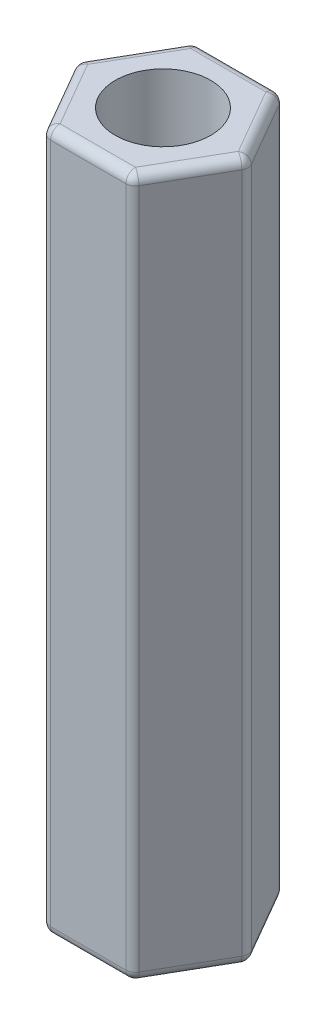
ISO-10303-21;
HEADER;
FILE_DESCRIPTION(('STEP AP214'),'2;1');
FILE_NAME('part.step','',(''),(''),'','','');
FILE_SCHEMA(('AUTOMOTIVE_DESIGN { 1 0 10303 214 1 1 1 1 }'));
ENDSEC;
DATA;
#1=APPLICATION_CONTEXT('core data for automotive mechanical design processes');
#2=APPLICATION_PROTOCOL_DEFINITION('international standard','automotive_design',2000,#1);
#3=PRODUCT_CONTEXT('',#1,'mechanical');
#4=PRODUCT('Part','Part','',(#3));
#5=PRODUCT_RELATED_PRODUCT_CATEGORY('part','',(#4));
#6=PRODUCT_DEFINITION_FORMATION('','',#4);
#7=PRODUCT_DEFINITION_CONTEXT('part definition',#1,'design');
#8=PRODUCT_DEFINITION('design','',#6,#7);
#9=PRODUCT_DEFINITION_SHAPE('','',#8);
#10=(LENGTH_UNIT() NAMED_UNIT(*) SI_UNIT(.MILLI.,.METRE.));
#11=(NAMED_UNIT(*) PLANE_ANGLE_UNIT() SI_UNIT($,.RADIAN.));
#12=(NAMED_UNIT(*) SI_UNIT($,.STERADIAN.) SOLID_ANGLE_UNIT());
#13=UNCERTAINTY_MEASURE_WITH_UNIT(LENGTH_MEASURE(1.E-05),#10,'distance_accuracy_value','');
#14=(GEOMETRIC_REPRESENTATION_CONTEXT(3) GLOBAL_UNCERTAINTY_ASSIGNED_CONTEXT((#13)) GLOBAL_UNIT_ASSIGNED_CONTEXT((#10,
#11,#12)) REPRESENTATION_CONTEXT('',''));
#15=CARTESIAN_POINT('',(0.,0.,0.));
#16=DIRECTION('',(0.,0.,1.));
#17=DIRECTION('',(1.,0.,0.));
#18=AXIS2_PLACEMENT_3D('',#15,#16,#17);
#19=CARTESIAN_POINT('',(0.,22.,0.));
#20=DIRECTION('',(0.,1.,0.));
#21=DIRECTION('',(0.,0.,1.));
#22=AXIS2_PLACEMENT_3D('',#19,#20,#21);
#23=PLANE('',#22);
#24=DIRECTION('',(0.500000000000007,0.,0.866025403784435));
#25=VECTOR('',#24,1.);
#26=CARTESIAN_POINT('',(-1.09696551146027,22.,2.20000000000001));
#27=LINE('',#26,#25);
#28=CARTESIAN_POINT('',(-2.36713610367747,22.,0.));
#29=VERTEX_POINT('',#28);
#30=CARTESIAN_POINT('',(-1.18356805183872,22.,2.05000000000001));
#31=VERTEX_POINT('',#30);
#32=EDGE_CURVE('E255',#29,#31,#27,.T.);
#33=ORIENTED_EDGE('',*,*,#32,.T.);
#34=DIRECTION('',(1.,0.,0.));
#35=VECTOR('',#34,1.);
#36=CARTESIAN_POINT('',(1.35677313259565,22.,2.04999999999999));
#37=LINE('',#36,#35);
#38=CARTESIAN_POINT('',(1.18356805183876,22.,2.04999999999999));
#39=VERTEX_POINT('',#38);
#40=EDGE_CURVE('E257',#31,#39,#37,.T.);
#41=ORIENTED_EDGE('',*,*,#40,.T.);
#42=DIRECTION('',(0.499999999999995,0.,-0.866025403784442));
#43=VECTOR('',#42,1.);
#44=CARTESIAN_POINT('',(2.45373864405591,22.,-0.149999999999998));
#45=LINE('',#44,#43);
#46=CARTESIAN_POINT('',(2.36713610367747,22.,0.));
#47=VERTEX_POINT('',#46);
#48=EDGE_CURVE('E247',#39,#47,#45,.T.);
#49=ORIENTED_EDGE('',*,*,#48,.T.);
#50=DIRECTION('',(-0.500000000000001,0.,-0.866025403784438));
#51=VECTOR('',#50,1.);
#52=CARTESIAN_POINT('',(1.09696551146028,22.,-2.20000000000001));
#53=LINE('',#52,#51);
#54=CARTESIAN_POINT('',(1.18356805183873,22.,-2.05000000000001));
#55=VERTEX_POINT('',#54);
#56=EDGE_CURVE('E249',#47,#55,#53,.T.);
#57=ORIENTED_EDGE('',*,*,#56,.T.);
#58=DIRECTION('',(-1.,0.,0.));
#59=VECTOR('',#58,1.);
#60=CARTESIAN_POINT('',(-1.35677313259563,22.,-2.05));
#61=LINE('',#60,#59);
#62=CARTESIAN_POINT('',(-1.18356805183874,22.,-2.05));
#63=VERTEX_POINT('',#62);
#64=EDGE_CURVE('E251',#55,#63,#61,.T.);
#65=ORIENTED_EDGE('',*,*,#64,.T.);
#66=DIRECTION('',(-0.499999999999995,0.,0.866025403784442));
#67=VECTOR('',#66,1.);
#68=CARTESIAN_POINT('',(-2.45373864405591,22.,0.150000000000017));
#69=LINE('',#68,#67);
#70=EDGE_CURVE('E253',#63,#29,#69,.T.);
#71=ORIENTED_EDGE('',*,*,#70,.T.);
#72=EDGE_LOOP('',(#33,#41,#49,#57,#65,#71));
#73=FACE_BOUND('',#72,.T.);
#74=CARTESIAN_POINT('',(0.,22.,0.));
#75=DIRECTION('',(0.,1.,0.));
#76=DIRECTION('',(0.,0.,1.));
#77=AXIS2_PLACEMENT_3D('',#74,#75,#76);
#78=CIRCLE('',#77,1.5);
#79=CARTESIAN_POINT('',(0.,22.,1.5));
#80=VERTEX_POINT('',#79);
#81=EDGE_CURVE('E194',#80,#80,#78,.T.);
#82=ORIENTED_EDGE('',*,*,#81,.F.);
#83=EDGE_LOOP('',(#82));
#84=FACE_BOUND('',#83,.T.);
#85=ADVANCED_FACE('F37',(#73,#84),#23,.T.);
#86=CARTESIAN_POINT('',(0.,0.,0.));
#87=DIRECTION('',(0.,1.,0.));
#88=DIRECTION('',(0.,0.,1.));
#89=AXIS2_PLACEMENT_3D('',#86,#87,#88);
#90=PLANE('',#89);
#91=DIRECTION('',(0.499999999999995,0.,-0.866025403784442));
#92=VECTOR('',#91,1.);
#93=CARTESIAN_POINT('',(1.77535207775811,0.,1.02499999999999));
#94=LINE('',#93,#92);
#95=CARTESIAN_POINT('',(2.36713610367747,0.,0.));
#96=VERTEX_POINT('',#95);
#97=CARTESIAN_POINT('',(1.18356805183876,0.,2.04999999999999));
#98=VERTEX_POINT('',#97);
#99=EDGE_CURVE('E260',#96,#98,#94,.F.);
#100=ORIENTED_EDGE('',*,*,#99,.T.);
#101=DIRECTION('',(1.,0.,0.));
#102=VECTOR('',#101,1.);
#103=CARTESIAN_POINT('',(0.,0.,2.05));
#104=LINE('',#103,#102);
#105=CARTESIAN_POINT('',(-1.18356805183872,0.,2.05000000000001));
#106=VERTEX_POINT('',#105);
#107=EDGE_CURVE('E11',#98,#106,#104,.F.);
#108=ORIENTED_EDGE('',*,*,#107,.T.);
#109=DIRECTION('',(0.500000000000007,0.,0.866025403784435));
#110=VECTOR('',#109,1.);
#111=CARTESIAN_POINT('',(-1.77535207775809,0.,1.02500000000001));
#112=LINE('',#111,#110);
#113=CARTESIAN_POINT('',(-2.36713610367747,0.,0.));
#114=VERTEX_POINT('',#113);
#115=EDGE_CURVE('E46',#106,#114,#112,.F.);
#116=ORIENTED_EDGE('',*,*,#115,.T.);
#117=DIRECTION('',(-0.499999999999995,0.,0.866025403784442));
#118=VECTOR('',#117,1.);
#119=CARTESIAN_POINT('',(-1.77535207775811,0.,-1.02499999999999));
#120=LINE('',#119,#118);
#121=CARTESIAN_POINT('',(-1.18356805183874,0.,-2.05));
#122=VERTEX_POINT('',#121);
#123=EDGE_CURVE('E266',#114,#122,#120,.F.);
#124=ORIENTED_EDGE('',*,*,#123,.T.);
#125=DIRECTION('',(-1.,0.,0.));
#126=VECTOR('',#125,1.);
#127=CARTESIAN_POINT('',(0.,0.,-2.05));
#128=LINE('',#127,#126);
#129=CARTESIAN_POINT('',(1.18356805183873,0.,-2.05000000000001));
#130=VERTEX_POINT('',#129);
#131=EDGE_CURVE('E264',#122,#130,#128,.F.);
#132=ORIENTED_EDGE('',*,*,#131,.T.);
#133=DIRECTION('',(-0.500000000000001,0.,-0.866025403784438));
#134=VECTOR('',#133,1.);
#135=CARTESIAN_POINT('',(1.7753520777581,0.,-1.025));
#136=LINE('',#135,#134);
#137=EDGE_CURVE('E262',#130,#96,#136,.F.);
#138=ORIENTED_EDGE('',*,*,#137,.T.);
#139=EDGE_LOOP('',(#100,#108,#116,#124,#132,#138));
#140=FACE_BOUND('',#139,.T.);
#141=CARTESIAN_POINT('',(0.,0.,0.));
#142=DIRECTION('',(0.,1.,0.));
#143=DIRECTION('',(0.,0.,1.));
#144=AXIS2_PLACEMENT_3D('',#141,#142,#143);
#145=CIRCLE('',#144,1.5);
#146=CARTESIAN_POINT('',(0.,0.,1.5));
#147=VERTEX_POINT('',#146);
#148=EDGE_CURVE('E358',#147,#147,#145,.T.);
#149=ORIENTED_EDGE('',*,*,#148,.T.);
#150=EDGE_LOOP('',(#149));
#151=FACE_BOUND('',#150,.T.);
#152=ADVANCED_FACE('F375',(#140,#151),#90,.F.);
#153=CARTESIAN_POINT('',(1.35677313259565,22.,2.34999999999999));
#154=DIRECTION('',(-0.866025403784442,0.,-0.499999999999995));
#155=DIRECTION('',(-0.499999999999995,0.,0.866025403784442));
#156=AXIS2_PLACEMENT_3D('',#153,#154,#155);
#157=PLANE('',#156);
#158=DIRECTION('',(0.,-1.,0.));
#159=VECTOR('',#158,1.);
#160=CARTESIAN_POINT('',(2.6269437248128,22.,0.15));
#161=LINE('',#160,#159);
#162=CARTESIAN_POINT('',(2.6269437248128,0.300000000000002,0.15));
#163=VERTEX_POINT('',#162);
#164=CARTESIAN_POINT('',(2.6269437248128,21.7,0.15));
#165=VERTEX_POINT('',#164);
#166=EDGE_CURVE('E171',#163,#165,#161,.F.);
#167=ORIENTED_EDGE('',*,*,#166,.T.);
#168=DIRECTION('',(0.499999999999995,0.,-0.866025403784442));
#169=VECTOR('',#168,1.);
#170=CARTESIAN_POINT('',(1.35677313259565,21.7,2.34999999999999));
#171=LINE('',#170,#169);
#172=CARTESIAN_POINT('',(1.44337567297409,21.7,2.19999999999999));
#173=VERTEX_POINT('',#172);
#174=EDGE_CURVE('E209',#165,#173,#171,.F.);
#175=ORIENTED_EDGE('',*,*,#174,.T.);
#176=DIRECTION('',(0.,-1.,0.));
#177=VECTOR('',#176,1.);
#178=CARTESIAN_POINT('',(1.44337567297409,22.,2.19999999999999));
#179=LINE('',#178,#177);
#180=CARTESIAN_POINT('',(1.44337567297409,0.300000000000002,2.19999999999999));
#181=VERTEX_POINT('',#180);
#182=EDGE_CURVE('E206',#173,#181,#179,.T.);
#183=ORIENTED_EDGE('',*,*,#182,.T.);
#184=DIRECTION('',(0.499999999999995,0.,-0.866025403784442));
#185=VECTOR('',#184,1.);
#186=CARTESIAN_POINT('',(1.35677313259565,0.300000000000002,2.34999999999999));
#187=LINE('',#186,#185);
#188=EDGE_CURVE('E201',#181,#163,#187,.T.);
#189=ORIENTED_EDGE('',*,*,#188,.T.);
#190=EDGE_LOOP('',(#167,#175,#183,#189));
#191=FACE_BOUND('',#190,.T.);
#192=ADVANCED_FACE('F381',(#191),#157,.F.);
#193=CARTESIAN_POINT('',(2.71354626519124,22.,0.));
#194=DIRECTION('',(-0.866025403784438,0.,0.500000000000001));
#195=DIRECTION('',(0.500000000000001,0.,0.866025403784438));
#196=AXIS2_PLACEMENT_3D('',#193,#194,#195);
#197=PLANE('',#196);
#198=DIRECTION('',(0.,-1.,0.));
#199=VECTOR('',#198,1.);
#200=CARTESIAN_POINT('',(1.44337567297406,22.,-2.20000000000001));
#201=LINE('',#200,#199);
#202=CARTESIAN_POINT('',(1.44337567297406,0.300000000000002,-2.20000000000001));
#203=VERTEX_POINT('',#202);
#204=CARTESIAN_POINT('',(1.44337567297406,21.7,-2.20000000000001));
#205=VERTEX_POINT('',#204);
#206=EDGE_CURVE('E193',#203,#205,#201,.F.);
#207=ORIENTED_EDGE('',*,*,#206,.T.);
#208=DIRECTION('',(-0.500000000000001,0.,-0.866025403784438));
#209=VECTOR('',#208,1.);
#210=CARTESIAN_POINT('',(2.71354626519124,21.7,0.));
#211=LINE('',#210,#209);
#212=CARTESIAN_POINT('',(2.6269437248128,21.7,-0.149999999999999));
#213=VERTEX_POINT('',#212);
#214=EDGE_CURVE('E198',#205,#213,#211,.F.);
#215=ORIENTED_EDGE('',*,*,#214,.T.);
#216=DIRECTION('',(0.,-1.,0.));
#217=VECTOR('',#216,1.);
#218=CARTESIAN_POINT('',(2.6269437248128,22.,-0.149999999999999));
#219=LINE('',#218,#217);
#220=CARTESIAN_POINT('',(2.6269437248128,0.300000000000002,-0.149999999999999));
#221=VERTEX_POINT('',#220);
#222=EDGE_CURVE('E169',#213,#221,#219,.T.);
#223=ORIENTED_EDGE('',*,*,#222,.T.);
#224=DIRECTION('',(-0.500000000000001,0.,-0.866025403784438));
#225=VECTOR('',#224,1.);
#226=CARTESIAN_POINT('',(2.71354626519124,0.300000000000002,0.));
#227=LINE('',#226,#225);
#228=EDGE_CURVE('E187',#221,#203,#227,.T.);
#229=ORIENTED_EDGE('',*,*,#228,.T.);
#230=EDGE_LOOP('',(#207,#215,#223,#229));
#231=FACE_BOUND('',#230,.T.);
#232=ADVANCED_FACE('F196',(#231),#197,.F.);
#233=CARTESIAN_POINT('',(1.35677313259562,22.,-2.35000000000001));
#234=DIRECTION('',(0.,0.,1.));
#235=DIRECTION('',(1.,0.,0.));
#236=AXIS2_PLACEMENT_3D('',#233,#234,#235);
#237=PLANE('',#236);
#238=DIRECTION('',(0.,-1.,0.));
#239=VECTOR('',#238,1.);
#240=CARTESIAN_POINT('',(-1.18356805183874,22.,-2.35));
#241=LINE('',#240,#239);
#242=CARTESIAN_POINT('',(-1.18356805183874,0.300000000000002,-2.35));
#243=VERTEX_POINT('',#242);
#244=CARTESIAN_POINT('',(-1.18356805183874,21.7,-2.35));
#245=VERTEX_POINT('',#244);
#246=EDGE_CURVE('E213',#243,#245,#241,.F.);
#247=ORIENTED_EDGE('',*,*,#246,.T.);
#248=DIRECTION('',(-1.,0.,0.));
#249=VECTOR('',#248,1.);
#250=CARTESIAN_POINT('',(1.35677313259562,21.7,-2.35000000000001));
#251=LINE('',#250,#249);
#252=CARTESIAN_POINT('',(1.18356805183873,21.7,-2.35));
#253=VERTEX_POINT('',#252);
#254=EDGE_CURVE('E218',#245,#253,#251,.F.);
#255=ORIENTED_EDGE('',*,*,#254,.T.);
#256=DIRECTION('',(0.,-1.,0.));
#257=VECTOR('',#256,1.);
#258=CARTESIAN_POINT('',(1.18356805183873,22.,-2.35));
#259=LINE('',#258,#257);
#260=CARTESIAN_POINT('',(1.18356805183873,0.300000000000002,-2.35));
#261=VERTEX_POINT('',#260);
#262=EDGE_CURVE('E215',#253,#261,#259,.T.);
#263=ORIENTED_EDGE('',*,*,#262,.T.);
#264=DIRECTION('',(-1.,0.,0.));
#265=VECTOR('',#264,1.);
#266=CARTESIAN_POINT('',(1.35677313259562,0.300000000000002,-2.35000000000001));
#267=LINE('',#266,#265);
#268=EDGE_CURVE('E211',#261,#243,#267,.T.);
#269=ORIENTED_EDGE('',*,*,#268,.T.);
#270=EDGE_LOOP('',(#247,#255,#263,#269));
#271=FACE_BOUND('',#270,.T.);
#272=ADVANCED_FACE('F396',(#271),#237,.F.);
#273=CARTESIAN_POINT('',(-1.35677313259563,22.,-2.35));
#274=DIRECTION('',(0.866025403784442,0.,0.499999999999995));
#275=DIRECTION('',(0.499999999999995,0.,-0.866025403784442));
#276=AXIS2_PLACEMENT_3D('',#273,#274,#275);
#277=PLANE('',#276);
#278=DIRECTION('',(0.,-1.,0.));
#279=VECTOR('',#278,1.);
#280=CARTESIAN_POINT('',(-2.6269437248128,22.,-0.149999999999982));
#281=LINE('',#280,#279);
#282=CARTESIAN_POINT('',(-2.6269437248128,0.300000000000002,-0.149999999999982));
#283=VERTEX_POINT('',#282);
#284=CARTESIAN_POINT('',(-2.6269437248128,21.7,-0.149999999999982));
#285=VERTEX_POINT('',#284);
#286=EDGE_CURVE('E222',#283,#285,#281,.F.);
#287=ORIENTED_EDGE('',*,*,#286,.T.);
#288=DIRECTION('',(-0.499999999999995,0.,0.866025403784442));
#289=VECTOR('',#288,1.);
#290=CARTESIAN_POINT('',(-1.35677313259563,21.7,-2.35));
#291=LINE('',#290,#289);
#292=CARTESIAN_POINT('',(-1.44337567297408,21.7,-2.19999999999999));
#293=VERTEX_POINT('',#292);
#294=EDGE_CURVE('E227',#285,#293,#291,.F.);
#295=ORIENTED_EDGE('',*,*,#294,.T.);
#296=DIRECTION('',(0.,-1.,0.));
#297=VECTOR('',#296,1.);
#298=CARTESIAN_POINT('',(-1.44337567297408,22.,-2.19999999999999));
#299=LINE('',#298,#297);
#300=CARTESIAN_POINT('',(-1.44337567297408,0.300000000000002,-2.19999999999999));
#301=VERTEX_POINT('',#300);
#302=EDGE_CURVE('E224',#293,#301,#299,.T.);
#303=ORIENTED_EDGE('',*,*,#302,.T.);
#304=DIRECTION('',(-0.499999999999995,0.,0.866025403784442));
#305=VECTOR('',#304,1.);
#306=CARTESIAN_POINT('',(-1.35677313259563,0.300000000000002,-2.35));
#307=LINE('',#306,#305);
#308=EDGE_CURVE('E220',#301,#283,#307,.T.);
#309=ORIENTED_EDGE('',*,*,#308,.T.);
#310=EDGE_LOOP('',(#287,#295,#303,#309));
#311=FACE_BOUND('',#310,.T.);
#312=ADVANCED_FACE('F392',(#311),#277,.F.);
#313=CARTESIAN_POINT('',(-2.71354626519124,22.,0.));
#314=DIRECTION('',(0.866025403784435,0.,-0.500000000000007));
#315=DIRECTION('',(-0.500000000000007,0.,-0.866025403784435));
#316=AXIS2_PLACEMENT_3D('',#313,#314,#315);
#317=PLANE('',#316);
#318=DIRECTION('',(0.,-1.,0.));
#319=VECTOR('',#318,1.);
#320=CARTESIAN_POINT('',(-1.44337567297405,22.,2.20000000000001));
#321=LINE('',#320,#319);
#322=CARTESIAN_POINT('',(-1.44337567297405,0.300000000000002,2.20000000000001));
#323=VERTEX_POINT('',#322);
#324=CARTESIAN_POINT('',(-1.44337567297405,21.7,2.20000000000001));
#325=VERTEX_POINT('',#324);
#326=EDGE_CURVE('E231',#323,#325,#321,.F.);
#327=ORIENTED_EDGE('',*,*,#326,.T.);
#328=DIRECTION('',(0.500000000000007,0.,0.866025403784435));
#329=VECTOR('',#328,1.);
#330=CARTESIAN_POINT('',(-2.71354626519124,21.7,0.));
#331=LINE('',#330,#329);
#332=CARTESIAN_POINT('',(-2.6269437248128,21.7,0.150000000000018));
#333=VERTEX_POINT('',#332);
#334=EDGE_CURVE('E236',#325,#333,#331,.F.);
#335=ORIENTED_EDGE('',*,*,#334,.T.);
#336=DIRECTION('',(0.,-1.,0.));
#337=VECTOR('',#336,1.);
#338=CARTESIAN_POINT('',(-2.6269437248128,22.,0.150000000000018));
#339=LINE('',#338,#337);
#340=CARTESIAN_POINT('',(-2.6269437248128,0.300000000000002,0.150000000000018));
#341=VERTEX_POINT('',#340);
#342=EDGE_CURVE('E233',#333,#341,#339,.T.);
#343=ORIENTED_EDGE('',*,*,#342,.T.);
#344=DIRECTION('',(0.500000000000007,0.,0.866025403784435));
#345=VECTOR('',#344,1.);
#346=CARTESIAN_POINT('',(-2.71354626519124,0.300000000000002,0.));
#347=LINE('',#346,#345);
#348=EDGE_CURVE('E229',#341,#323,#347,.T.);
#349=ORIENTED_EDGE('',*,*,#348,.T.);
#350=EDGE_LOOP('',(#327,#335,#343,#349));
#351=FACE_BOUND('',#350,.T.);
#352=ADVANCED_FACE('F388',(#351),#317,.F.);
#353=CARTESIAN_POINT('',(-1.3567731325956,22.,2.35000000000001));
#354=DIRECTION('',(0.,0.,-1.));
#355=DIRECTION('',(-1.,0.,0.));
#356=AXIS2_PLACEMENT_3D('',#353,#354,#355);
#357=PLANE('',#356);
#358=DIRECTION('',(0.,-1.,0.));
#359=VECTOR('',#358,1.);
#360=CARTESIAN_POINT('',(1.18356805183876,22.,2.34999999999999));
#361=LINE('',#360,#359);
#362=CARTESIAN_POINT('',(1.18356805183876,0.300000000000002,2.34999999999999));
#363=VERTEX_POINT('',#362);
#364=CARTESIAN_POINT('',(1.18356805183876,21.7,2.34999999999999));
#365=VERTEX_POINT('',#364);
#366=EDGE_CURVE('E240',#363,#365,#361,.F.);
#367=ORIENTED_EDGE('',*,*,#366,.T.);
#368=DIRECTION('',(1.,0.,0.));
#369=VECTOR('',#368,1.);
#370=CARTESIAN_POINT('',(-1.3567731325956,21.7,2.35000000000001));
#371=LINE('',#370,#369);
#372=CARTESIAN_POINT('',(-1.18356805183871,21.7,2.35000000000001));
#373=VERTEX_POINT('',#372);
#374=EDGE_CURVE('E245',#365,#373,#371,.F.);
#375=ORIENTED_EDGE('',*,*,#374,.T.);
#376=DIRECTION('',(0.,-1.,0.));
#377=VECTOR('',#376,1.);
#378=CARTESIAN_POINT('',(-1.18356805183871,22.,2.35000000000001));
#379=LINE('',#378,#377);
#380=CARTESIAN_POINT('',(-1.18356805183871,0.300000000000002,2.35000000000001));
#381=VERTEX_POINT('',#380);
#382=EDGE_CURVE('E242',#373,#381,#379,.T.);
#383=ORIENTED_EDGE('',*,*,#382,.T.);
#384=DIRECTION('',(1.,0.,0.));
#385=VECTOR('',#384,1.);
#386=CARTESIAN_POINT('',(-1.3567731325956,0.300000000000002,2.35000000000001));
#387=LINE('',#386,#385);
#388=EDGE_CURVE('E238',#381,#363,#387,.T.);
#389=ORIENTED_EDGE('',*,*,#388,.T.);
#390=EDGE_LOOP('',(#367,#375,#383,#389));
#391=FACE_BOUND('',#390,.T.);
#392=ADVANCED_FACE('F385',(#391),#357,.F.);
#393=CARTESIAN_POINT('',(0.,22.,0.));
#394=DIRECTION('',(0.,-1.,0.));
#395=DIRECTION('',(0.,0.,-1.));
#396=AXIS2_PLACEMENT_3D('',#393,#394,#395);
#397=CYLINDRICAL_SURFACE('',#396,1.5);
#398=ORIENTED_EDGE('',*,*,#81,.T.);
#399=EDGE_LOOP('',(#398));
#400=FACE_BOUND('',#399,.T.);
#401=ORIENTED_EDGE('',*,*,#148,.F.);
#402=EDGE_LOOP('',(#401));
#403=FACE_BOUND('',#402,.T.);
#404=ADVANCED_FACE('F371',(#400,#403),#397,.F.);
#405=CARTESIAN_POINT('',(-2.36713610367747,22.,0.));
#406=DIRECTION('',(0.,-1.,0.));
#407=DIRECTION('',(0.,0.,-1.));
#408=AXIS2_PLACEMENT_3D('',#405,#406,#407);
#409=CYLINDRICAL_SURFACE('',#408,0.3);
#410=CARTESIAN_POINT('',(-2.36713610367747,21.7,0.));
#411=DIRECTION('',(0.,1.,0.));
#412=DIRECTION('',(0.,0.,1.));
#413=AXIS2_PLACEMENT_3D('',#410,#411,#412);
#414=CIRCLE('',#413,0.3);
#415=EDGE_CURVE('E41',#285,#333,#414,.T.);
#416=ORIENTED_EDGE('',*,*,#415,.F.);
#417=ORIENTED_EDGE('',*,*,#286,.F.);
#418=CARTESIAN_POINT('',(-2.36713610367747,0.300000000000002,0.));
#419=DIRECTION('',(0.,-1.,0.));
#420=DIRECTION('',(0.,0.,-1.));
#421=AXIS2_PLACEMENT_3D('',#418,#419,#420);
#422=CIRCLE('',#421,0.3);
#423=EDGE_CURVE('E351',#341,#283,#422,.T.);
#424=ORIENTED_EDGE('',*,*,#423,.F.);
#425=ORIENTED_EDGE('',*,*,#342,.F.);
#426=EDGE_LOOP('',(#416,#417,#424,#425));
#427=FACE_BOUND('',#426,.T.);
#428=ADVANCED_FACE('F39',(#427),#409,.T.);
#429=CARTESIAN_POINT('',(-2.36713610367747,21.7,0.));
#430=DIRECTION('',(0.,0.,1.));
#431=DIRECTION('',(1.,0.,0.));
#432=AXIS2_PLACEMENT_3D('',#429,#430,#431);
#433=SPHERICAL_SURFACE('',#432,0.3);
#434=CARTESIAN_POINT('',(-2.36713610367747,21.7,0.));
#435=DIRECTION('',(-0.499999999999995,0.,0.866025403784442));
#436=DIRECTION('',(0.866025403784442,0.,0.499999999999995));
#437=AXIS2_PLACEMENT_3D('',#434,#435,#436);
#438=CIRCLE('',#437,0.3);
#439=EDGE_CURVE('E346',#285,#29,#438,.F.);
#440=ORIENTED_EDGE('',*,*,#439,.F.);
#441=ORIENTED_EDGE('',*,*,#415,.T.);
#442=CARTESIAN_POINT('',(-2.36713610367747,21.7,0.));
#443=DIRECTION('',(-0.500000000000007,0.,-0.866025403784434));
#444=DIRECTION('',(-0.866025403784435,0.,0.500000000000007));
#445=AXIS2_PLACEMENT_3D('',#442,#443,#444);
#446=CIRCLE('',#445,0.3);
#447=EDGE_CURVE('E349',#29,#333,#446,.F.);
#448=ORIENTED_EDGE('',*,*,#447,.F.);
#449=EDGE_LOOP('',(#440,#441,#448));
#450=FACE_BOUND('',#449,.T.);
#451=ADVANCED_FACE('F509',(#450),#433,.T.);
#452=CARTESIAN_POINT('',(-2.36713610367747,0.3,0.));
#453=DIRECTION('',(0.,0.,1.));
#454=DIRECTION('',(1.,0.,0.));
#455=AXIS2_PLACEMENT_3D('',#452,#453,#454);
#456=SPHERICAL_SURFACE('',#455,0.3);
#457=CARTESIAN_POINT('',(-2.36713610367747,0.3,0.));
#458=DIRECTION('',(-0.500000000000005,0.,-0.866025403784435));
#459=DIRECTION('',(-0.866025403784436,0.,0.500000000000005));
#460=AXIS2_PLACEMENT_3D('',#457,#458,#459);
#461=CIRCLE('',#460,0.3);
#462=EDGE_CURVE('E341',#341,#114,#461,.F.);
#463=ORIENTED_EDGE('',*,*,#462,.F.);
#464=ORIENTED_EDGE('',*,*,#423,.T.);
#465=CARTESIAN_POINT('',(-2.36713610367747,0.300000000000002,0.));
#466=DIRECTION('',(-0.499999999999995,0.,0.866025403784441));
#467=DIRECTION('',(0.866025403784441,0.,0.499999999999995));
#468=AXIS2_PLACEMENT_3D('',#465,#466,#467);
#469=CIRCLE('',#468,0.3);
#470=EDGE_CURVE('E343',#114,#283,#469,.F.);
#471=ORIENTED_EDGE('',*,*,#470,.F.);
#472=EDGE_LOOP('',(#463,#464,#471));
#473=FACE_BOUND('',#472,.T.);
#474=ADVANCED_FACE('F506',(#473),#456,.T.);
#475=CARTESIAN_POINT('',(-1.77535207775809,21.7,1.02500000000001));
#476=DIRECTION('',(-0.500000000000007,0.,-0.866025403784435));
#477=DIRECTION('',(-0.866025403784435,0.,0.500000000000007));
#478=AXIS2_PLACEMENT_3D('',#475,#476,#477);
#479=CYLINDRICAL_SURFACE('',#478,0.3);
#480=ORIENTED_EDGE('',*,*,#447,.T.);
#481=ORIENTED_EDGE('',*,*,#334,.F.);
#482=CARTESIAN_POINT('',(-1.18356805183872,21.7,2.05000000000001));
#483=DIRECTION('',(0.500000000000007,0.,0.866025403784434));
#484=DIRECTION('',(0.866025403784435,0.,-0.500000000000007));
#485=AXIS2_PLACEMENT_3D('',#482,#483,#484);
#486=CIRCLE('',#485,0.3);
#487=EDGE_CURVE('E335',#31,#325,#486,.T.);
#488=ORIENTED_EDGE('',*,*,#487,.F.);
#489=ORIENTED_EDGE('',*,*,#32,.F.);
#490=EDGE_LOOP('',(#480,#481,#488,#489));
#491=FACE_BOUND('',#490,.T.);
#492=ADVANCED_FACE('F502',(#491),#479,.T.);
#493=CARTESIAN_POINT('',(-1.77535207775811,21.7,-1.02499999999999));
#494=DIRECTION('',(0.499999999999995,0.,-0.866025403784442));
#495=DIRECTION('',(-0.866025403784442,0.,-0.499999999999995));
#496=AXIS2_PLACEMENT_3D('',#493,#494,#495);
#497=CYLINDRICAL_SURFACE('',#496,0.3);
#498=ORIENTED_EDGE('',*,*,#439,.T.);
#499=ORIENTED_EDGE('',*,*,#70,.F.);
#500=CARTESIAN_POINT('',(-1.18356805183874,21.7,-2.05));
#501=DIRECTION('',(0.499999999999996,0.,-0.866025403784441));
#502=DIRECTION('',(-0.866025403784441,0.,-0.499999999999996));
#503=AXIS2_PLACEMENT_3D('',#500,#501,#502);
#504=CIRCLE('',#503,0.3);
#505=EDGE_CURVE('E332',#293,#63,#504,.T.);
#506=ORIENTED_EDGE('',*,*,#505,.F.);
#507=ORIENTED_EDGE('',*,*,#294,.F.);
#508=EDGE_LOOP('',(#498,#499,#506,#507));
#509=FACE_BOUND('',#508,.T.);
#510=ADVANCED_FACE('F498',(#509),#497,.T.);
#511=CARTESIAN_POINT('',(-1.18356805183874,22.,-2.05));
#512=DIRECTION('',(0.,-1.,0.));
#513=DIRECTION('',(0.,0.,-1.));
#514=AXIS2_PLACEMENT_3D('',#511,#512,#513);
#515=CYLINDRICAL_SURFACE('',#514,0.3);
#516=CARTESIAN_POINT('',(-1.18356805183874,0.300000000000002,-2.05));
#517=DIRECTION('',(0.,-1.,0.));
#518=DIRECTION('',(0.,0.,-1.));
#519=AXIS2_PLACEMENT_3D('',#516,#517,#518);
#520=CIRCLE('',#519,0.3);
#521=EDGE_CURVE('E326',#301,#243,#520,.T.);
#522=ORIENTED_EDGE('',*,*,#521,.F.);
#523=ORIENTED_EDGE('',*,*,#302,.F.);
#524=CARTESIAN_POINT('',(-1.18356805183874,21.7,-2.05));
#525=DIRECTION('',(0.,1.,0.));
#526=DIRECTION('',(0.,0.,1.));
#527=AXIS2_PLACEMENT_3D('',#524,#525,#526);
#528=CIRCLE('',#527,0.3);
#529=EDGE_CURVE('E329',#245,#293,#528,.T.);
#530=ORIENTED_EDGE('',*,*,#529,.F.);
#531=ORIENTED_EDGE('',*,*,#246,.F.);
#532=EDGE_LOOP('',(#522,#523,#530,#531));
#533=FACE_BOUND('',#532,.T.);
#534=ADVANCED_FACE('F494',(#533),#515,.T.);
#535=CARTESIAN_POINT('',(-1.0969655114603,0.300000000000002,-2.2));
#536=DIRECTION('',(-0.499999999999995,0.,0.866025403784442));
#537=DIRECTION('',(0.866025403784442,0.,0.499999999999995));
#538=AXIS2_PLACEMENT_3D('',#535,#536,#537);
#539=CYLINDRICAL_SURFACE('',#538,0.3);
#540=ORIENTED_EDGE('',*,*,#470,.T.);
#541=ORIENTED_EDGE('',*,*,#308,.F.);
#542=CARTESIAN_POINT('',(-1.18356805183874,0.3,-2.05));
#543=DIRECTION('',(0.499999999999996,0.,-0.866025403784441));
#544=DIRECTION('',(-0.866025403784441,0.,-0.499999999999996));
#545=AXIS2_PLACEMENT_3D('',#542,#543,#544);
#546=CIRCLE('',#545,0.3);
#547=EDGE_CURVE('E324',#122,#301,#546,.T.);
#548=ORIENTED_EDGE('',*,*,#547,.F.);
#549=ORIENTED_EDGE('',*,*,#123,.F.);
#550=EDGE_LOOP('',(#540,#541,#548,#549));
#551=FACE_BOUND('',#550,.T.);
#552=ADVANCED_FACE('F490',(#551),#539,.T.);
#553=CARTESIAN_POINT('',(-2.45373864405591,0.300000000000002,-0.149999999999983));
#554=DIRECTION('',(0.500000000000007,0.,0.866025403784435));
#555=DIRECTION('',(0.866025403784435,0.,-0.500000000000007));
#556=AXIS2_PLACEMENT_3D('',#553,#554,#555);
#557=CYLINDRICAL_SURFACE('',#556,0.3);
#558=ORIENTED_EDGE('',*,*,#462,.T.);
#559=ORIENTED_EDGE('',*,*,#115,.F.);
#560=CARTESIAN_POINT('',(-1.18356805183871,0.300000000000002,2.05000000000001));
#561=DIRECTION('',(0.500000000000007,0.,0.866025403784435));
#562=DIRECTION('',(0.866025403784435,0.,-0.500000000000007));
#563=AXIS2_PLACEMENT_3D('',#560,#561,#562);
#564=CIRCLE('',#563,0.3);
#565=EDGE_CURVE('E322',#323,#106,#564,.T.);
#566=ORIENTED_EDGE('',*,*,#565,.F.);
#567=ORIENTED_EDGE('',*,*,#348,.F.);
#568=EDGE_LOOP('',(#558,#559,#566,#567));
#569=FACE_BOUND('',#568,.T.);
#570=ADVANCED_FACE('F486',(#569),#557,.T.);
#571=CARTESIAN_POINT('',(-1.18356805183872,22.,2.05000000000001));
#572=DIRECTION('',(0.,-1.,0.));
#573=DIRECTION('',(0.,0.,-1.));
#574=AXIS2_PLACEMENT_3D('',#571,#572,#573);
#575=CYLINDRICAL_SURFACE('',#574,0.3);
#576=CARTESIAN_POINT('',(-1.18356805183871,21.7,2.05000000000001));
#577=DIRECTION('',(0.,1.,0.));
#578=DIRECTION('',(0.,0.,1.));
#579=AXIS2_PLACEMENT_3D('',#576,#577,#578);
#580=CIRCLE('',#579,0.3);
#581=EDGE_CURVE('E338',#325,#373,#580,.T.);
#582=ORIENTED_EDGE('',*,*,#581,.F.);
#583=ORIENTED_EDGE('',*,*,#326,.F.);
#584=CARTESIAN_POINT('',(-1.18356805183872,0.300000000000002,2.05000000000001));
#585=DIRECTION('',(0.,-1.,0.));
#586=DIRECTION('',(0.,0.,-1.));
#587=AXIS2_PLACEMENT_3D('',#584,#585,#586);
#588=CIRCLE('',#587,0.3);
#589=EDGE_CURVE('E319',#381,#323,#588,.T.);
#590=ORIENTED_EDGE('',*,*,#589,.F.);
#591=ORIENTED_EDGE('',*,*,#382,.F.);
#592=EDGE_LOOP('',(#582,#583,#590,#591));
#593=FACE_BOUND('',#592,.T.);
#594=ADVANCED_FACE('F482',(#593),#575,.T.);
#595=CARTESIAN_POINT('',(-1.18356805183872,21.7,2.05000000000001));
#596=DIRECTION('',(0.,0.,1.));
#597=DIRECTION('',(1.,0.,0.));
#598=AXIS2_PLACEMENT_3D('',#595,#596,#597);
#599=SPHERICAL_SURFACE('',#598,0.3);
#600=ORIENTED_EDGE('',*,*,#487,.T.);
#601=ORIENTED_EDGE('',*,*,#581,.T.);
#602=CARTESIAN_POINT('',(-1.18356805183872,21.7,2.05000000000001));
#603=DIRECTION('',(-1.,0.,0.));
#604=DIRECTION('',(0.,0.,1.));
#605=AXIS2_PLACEMENT_3D('',#602,#603,#604);
#606=CIRCLE('',#605,0.3);
#607=EDGE_CURVE('E316',#31,#373,#606,.F.);
#608=ORIENTED_EDGE('',*,*,#607,.F.);
#609=EDGE_LOOP('',(#600,#601,#608));
#610=FACE_BOUND('',#609,.T.);
#611=ADVANCED_FACE('F478',(#610),#599,.T.);
#612=CARTESIAN_POINT('',(-1.18356805183874,21.7,-2.05));
#613=DIRECTION('',(0.,0.,1.));
#614=DIRECTION('',(1.,0.,0.));
#615=AXIS2_PLACEMENT_3D('',#612,#613,#614);
#616=SPHERICAL_SURFACE('',#615,0.3);
#617=ORIENTED_EDGE('',*,*,#529,.T.);
#618=ORIENTED_EDGE('',*,*,#505,.T.);
#619=CARTESIAN_POINT('',(-1.18356805183874,21.7,-2.05));
#620=DIRECTION('',(-1.,0.,0.));
#621=DIRECTION('',(0.,0.,1.));
#622=AXIS2_PLACEMENT_3D('',#619,#620,#621);
#623=CIRCLE('',#622,0.3);
#624=EDGE_CURVE('E313',#245,#63,#623,.F.);
#625=ORIENTED_EDGE('',*,*,#624,.F.);
#626=EDGE_LOOP('',(#617,#618,#625));
#627=FACE_BOUND('',#626,.T.);
#628=ADVANCED_FACE('F474',(#627),#616,.T.);
#629=CARTESIAN_POINT('',(-1.18356805183874,0.3,-2.05));
#630=DIRECTION('',(0.,0.,1.));
#631=DIRECTION('',(1.,0.,0.));
#632=AXIS2_PLACEMENT_3D('',#629,#630,#631);
#633=SPHERICAL_SURFACE('',#632,0.3);
#634=ORIENTED_EDGE('',*,*,#547,.T.);
#635=ORIENTED_EDGE('',*,*,#521,.T.);
#636=CARTESIAN_POINT('',(-1.18356805183874,0.300000000000002,-2.05));
#637=DIRECTION('',(-1.,0.,0.));
#638=DIRECTION('',(0.,0.,1.));
#639=AXIS2_PLACEMENT_3D('',#636,#637,#638);
#640=CIRCLE('',#639,0.3);
#641=EDGE_CURVE('E310',#122,#243,#640,.F.);
#642=ORIENTED_EDGE('',*,*,#641,.F.);
#643=EDGE_LOOP('',(#634,#635,#642));
#644=FACE_BOUND('',#643,.T.);
#645=ADVANCED_FACE('F470',(#644),#633,.T.);
#646=CARTESIAN_POINT('',(-1.18356805183872,0.3,2.05000000000001));
#647=DIRECTION('',(0.,0.,1.));
#648=DIRECTION('',(1.,0.,0.));
#649=AXIS2_PLACEMENT_3D('',#646,#647,#648);
#650=SPHERICAL_SURFACE('',#649,0.3);
#651=ORIENTED_EDGE('',*,*,#589,.T.);
#652=ORIENTED_EDGE('',*,*,#565,.T.);
#653=CARTESIAN_POINT('',(-1.18356805183872,0.3,2.05000000000001));
#654=DIRECTION('',(-1.,0.,0.));
#655=DIRECTION('',(0.,0.,1.));
#656=AXIS2_PLACEMENT_3D('',#653,#654,#655);
#657=CIRCLE('',#656,0.3);
#658=EDGE_CURVE('E54',#381,#106,#657,.F.);
#659=ORIENTED_EDGE('',*,*,#658,.F.);
#660=EDGE_LOOP('',(#651,#652,#659));
#661=FACE_BOUND('',#660,.T.);
#662=ADVANCED_FACE('F466',(#661),#650,.T.);
#663=CARTESIAN_POINT('',(0.,21.7,2.05));
#664=DIRECTION('',(-1.,0.,0.));
#665=DIRECTION('',(0.,0.,1.));
#666=AXIS2_PLACEMENT_3D('',#663,#664,#665);
#667=CYLINDRICAL_SURFACE('',#666,0.3);
#668=ORIENTED_EDGE('',*,*,#607,.T.);
#669=ORIENTED_EDGE('',*,*,#374,.F.);
#670=CARTESIAN_POINT('',(1.18356805183876,21.7,2.04999999999999));
#671=DIRECTION('',(1.,0.,0.));
#672=DIRECTION('',(0.,0.,-1.));
#673=AXIS2_PLACEMENT_3D('',#670,#671,#672);
#674=CIRCLE('',#673,0.3);
#675=EDGE_CURVE('E303',#39,#365,#674,.T.);
#676=ORIENTED_EDGE('',*,*,#675,.F.);
#677=ORIENTED_EDGE('',*,*,#40,.F.);
#678=EDGE_LOOP('',(#668,#669,#676,#677));
#679=FACE_BOUND('',#678,.T.);
#680=ADVANCED_FACE('F462',(#679),#667,.T.);
#681=CARTESIAN_POINT('',(0.,21.7,-2.05));
#682=DIRECTION('',(1.,0.,0.));
#683=DIRECTION('',(0.,0.,-1.));
#684=AXIS2_PLACEMENT_3D('',#681,#682,#683);
#685=CYLINDRICAL_SURFACE('',#684,0.3);
#686=ORIENTED_EDGE('',*,*,#624,.T.);
#687=ORIENTED_EDGE('',*,*,#64,.F.);
#688=CARTESIAN_POINT('',(1.18356805183873,21.7,-2.05000000000001));
#689=DIRECTION('',(1.,0.,0.));
#690=DIRECTION('',(0.,0.,-1.));
#691=AXIS2_PLACEMENT_3D('',#688,#689,#690);
#692=CIRCLE('',#691,0.3);
#693=EDGE_CURVE('E300',#253,#55,#692,.T.);
#694=ORIENTED_EDGE('',*,*,#693,.F.);
#695=ORIENTED_EDGE('',*,*,#254,.F.);
#696=EDGE_LOOP('',(#686,#687,#694,#695));
#697=FACE_BOUND('',#696,.T.);
#698=ADVANCED_FACE('F458',(#697),#685,.T.);
#699=CARTESIAN_POINT('',(1.18356805183873,22.,-2.05000000000001));
#700=DIRECTION('',(0.,-1.,0.));
#701=DIRECTION('',(0.,0.,-1.));
#702=AXIS2_PLACEMENT_3D('',#699,#700,#701);
#703=CYLINDRICAL_SURFACE('',#702,0.3);
#704=CARTESIAN_POINT('',(1.18356805183873,0.300000000000002,-2.05000000000001));
#705=DIRECTION('',(0.,-1.,0.));
#706=DIRECTION('',(0.,0.,-1.));
#707=AXIS2_PLACEMENT_3D('',#704,#705,#706);
#708=CIRCLE('',#707,0.3);
#709=EDGE_CURVE('E294',#261,#203,#708,.T.);
#710=ORIENTED_EDGE('',*,*,#709,.F.);
#711=ORIENTED_EDGE('',*,*,#262,.F.);
#712=CARTESIAN_POINT('',(1.18356805183873,21.7,-2.05000000000001));
#713=DIRECTION('',(0.,1.,0.));
#714=DIRECTION('',(0.,0.,1.));
#715=AXIS2_PLACEMENT_3D('',#712,#713,#714);
#716=CIRCLE('',#715,0.3);
#717=EDGE_CURVE('E297',#205,#253,#716,.T.);
#718=ORIENTED_EDGE('',*,*,#717,.F.);
#719=ORIENTED_EDGE('',*,*,#206,.F.);
#720=EDGE_LOOP('',(#710,#711,#718,#719));
#721=FACE_BOUND('',#720,.T.);
#722=ADVANCED_FACE('F454',(#721),#703,.T.);
#723=CARTESIAN_POINT('',(1.35677313259562,0.300000000000002,-2.05000000000001));
#724=DIRECTION('',(-1.,0.,0.));
#725=DIRECTION('',(0.,0.,1.));
#726=AXIS2_PLACEMENT_3D('',#723,#724,#725);
#727=CYLINDRICAL_SURFACE('',#726,0.3);
#728=ORIENTED_EDGE('',*,*,#641,.T.);
#729=ORIENTED_EDGE('',*,*,#268,.F.);
#730=CARTESIAN_POINT('',(1.18356805183873,0.3,-2.05000000000001));
#731=DIRECTION('',(1.,0.,0.));
#732=DIRECTION('',(0.,0.,-1.));
#733=AXIS2_PLACEMENT_3D('',#730,#731,#732);
#734=CIRCLE('',#733,0.3);
#735=EDGE_CURVE('E292',#130,#261,#734,.T.);
#736=ORIENTED_EDGE('',*,*,#735,.F.);
#737=ORIENTED_EDGE('',*,*,#131,.F.);
#738=EDGE_LOOP('',(#728,#729,#736,#737));
#739=FACE_BOUND('',#738,.T.);
#740=ADVANCED_FACE('F451',(#739),#727,.T.);
#741=CARTESIAN_POINT('',(-1.3567731325956,0.300000000000002,2.05000000000001));
#742=DIRECTION('',(1.,0.,0.));
#743=DIRECTION('',(0.,0.,-1.));
#744=AXIS2_PLACEMENT_3D('',#741,#742,#743);
#745=CYLINDRICAL_SURFACE('',#744,0.3);
#746=ORIENTED_EDGE('',*,*,#658,.T.);
#747=ORIENTED_EDGE('',*,*,#107,.F.);
#748=CARTESIAN_POINT('',(1.18356805183876,0.300000000000002,2.04999999999999));
#749=DIRECTION('',(1.,0.,0.));
#750=DIRECTION('',(0.,0.,-1.));
#751=AXIS2_PLACEMENT_3D('',#748,#749,#750);
#752=CIRCLE('',#751,0.3);
#753=EDGE_CURVE('E289',#363,#98,#752,.T.);
#754=ORIENTED_EDGE('',*,*,#753,.F.);
#755=ORIENTED_EDGE('',*,*,#388,.F.);
#756=EDGE_LOOP('',(#746,#747,#754,#755));
#757=FACE_BOUND('',#756,.T.);
#758=ADVANCED_FACE('F447',(#757),#745,.T.);
#759=CARTESIAN_POINT('',(1.18356805183876,22.,2.04999999999999));
#760=DIRECTION('',(0.,-1.,0.));
#761=DIRECTION('',(0.,0.,-1.));
#762=AXIS2_PLACEMENT_3D('',#759,#760,#761);
#763=CYLINDRICAL_SURFACE('',#762,0.3);
#764=CARTESIAN_POINT('',(1.18356805183876,21.7,2.04999999999999));
#765=DIRECTION('',(0.,1.,0.));
#766=DIRECTION('',(0.,0.,1.));
#767=AXIS2_PLACEMENT_3D('',#764,#765,#766);
#768=CIRCLE('',#767,0.3);
#769=EDGE_CURVE('E306',#365,#173,#768,.T.);
#770=ORIENTED_EDGE('',*,*,#769,.F.);
#771=ORIENTED_EDGE('',*,*,#366,.F.);
#772=CARTESIAN_POINT('',(1.18356805183876,0.300000000000002,2.04999999999999));
#773=DIRECTION('',(0.,-1.,0.));
#774=DIRECTION('',(0.,0.,-1.));
#775=AXIS2_PLACEMENT_3D('',#772,#773,#774);
#776=CIRCLE('',#775,0.3);
#777=EDGE_CURVE('E286',#181,#363,#776,.T.);
#778=ORIENTED_EDGE('',*,*,#777,.F.);
#779=ORIENTED_EDGE('',*,*,#182,.F.);
#780=EDGE_LOOP('',(#770,#771,#778,#779));
#781=FACE_BOUND('',#780,.T.);
#782=ADVANCED_FACE('F443',(#781),#763,.T.);
#783=CARTESIAN_POINT('',(1.18356805183876,21.7,2.04999999999999));
#784=DIRECTION('',(0.,0.,1.));
#785=DIRECTION('',(1.,0.,0.));
#786=AXIS2_PLACEMENT_3D('',#783,#784,#785);
#787=SPHERICAL_SURFACE('',#786,0.3);
#788=ORIENTED_EDGE('',*,*,#675,.T.);
#789=ORIENTED_EDGE('',*,*,#769,.T.);
#790=CARTESIAN_POINT('',(1.18356805183876,21.7,2.04999999999999));
#791=DIRECTION('',(-0.499999999999996,0.,0.866025403784441));
#792=DIRECTION('',(0.866025403784441,0.,0.499999999999996));
#793=AXIS2_PLACEMENT_3D('',#790,#791,#792);
#794=CIRCLE('',#793,0.3);
#795=EDGE_CURVE('E283',#39,#173,#794,.F.);
#796=ORIENTED_EDGE('',*,*,#795,.F.);
#797=EDGE_LOOP('',(#788,#789,#796));
#798=FACE_BOUND('',#797,.T.);
#799=ADVANCED_FACE('F439',(#798),#787,.T.);
#800=CARTESIAN_POINT('',(1.18356805183873,21.7,-2.05000000000001));
#801=DIRECTION('',(0.,0.,1.));
#802=DIRECTION('',(1.,0.,0.));
#803=AXIS2_PLACEMENT_3D('',#800,#801,#802);
#804=SPHERICAL_SURFACE('',#803,0.3);
#805=ORIENTED_EDGE('',*,*,#717,.T.);
#806=ORIENTED_EDGE('',*,*,#693,.T.);
#807=CARTESIAN_POINT('',(1.18356805183873,21.7,-2.05000000000001));
#808=DIRECTION('',(-0.500000000000001,0.,-0.866025403784438));
#809=DIRECTION('',(-0.866025403784438,0.,0.500000000000001));
#810=AXIS2_PLACEMENT_3D('',#807,#808,#809);
#811=CIRCLE('',#810,0.3);
#812=EDGE_CURVE('E280',#205,#55,#811,.F.);
#813=ORIENTED_EDGE('',*,*,#812,.F.);
#814=EDGE_LOOP('',(#805,#806,#813));
#815=FACE_BOUND('',#814,.T.);
#816=ADVANCED_FACE('F435',(#815),#804,.T.);
#817=CARTESIAN_POINT('',(1.18356805183873,0.3,-2.05000000000001));
#818=DIRECTION('',(0.,0.,1.));
#819=DIRECTION('',(1.,0.,0.));
#820=AXIS2_PLACEMENT_3D('',#817,#818,#819);
#821=SPHERICAL_SURFACE('',#820,0.3);
#822=ORIENTED_EDGE('',*,*,#735,.T.);
#823=ORIENTED_EDGE('',*,*,#709,.T.);
#824=CARTESIAN_POINT('',(1.18356805183873,0.300000000000002,-2.05000000000001));
#825=DIRECTION('',(-0.500000000000001,0.,-0.866025403784438));
#826=DIRECTION('',(-0.866025403784438,0.,0.500000000000001));
#827=AXIS2_PLACEMENT_3D('',#824,#825,#826);
#828=CIRCLE('',#827,0.3);
#829=EDGE_CURVE('E190',#130,#203,#828,.F.);
#830=ORIENTED_EDGE('',*,*,#829,.F.);
#831=EDGE_LOOP('',(#822,#823,#830));
#832=FACE_BOUND('',#831,.T.);
#833=ADVANCED_FACE('F431',(#832),#821,.T.);
#834=CARTESIAN_POINT('',(1.18356805183876,0.3,2.04999999999999));
#835=DIRECTION('',(0.,0.,1.));
#836=DIRECTION('',(1.,0.,0.));
#837=AXIS2_PLACEMENT_3D('',#834,#835,#836);
#838=SPHERICAL_SURFACE('',#837,0.3);
#839=ORIENTED_EDGE('',*,*,#777,.T.);
#840=ORIENTED_EDGE('',*,*,#753,.T.);
#841=CARTESIAN_POINT('',(1.18356805183876,0.3,2.04999999999999));
#842=DIRECTION('',(-0.499999999999996,0.,0.866025403784441));
#843=DIRECTION('',(0.866025403784441,0.,0.499999999999996));
#844=AXIS2_PLACEMENT_3D('',#841,#842,#843);
#845=CIRCLE('',#844,0.3);
#846=EDGE_CURVE('E276',#181,#98,#845,.F.);
#847=ORIENTED_EDGE('',*,*,#846,.F.);
#848=EDGE_LOOP('',(#839,#840,#847));
#849=FACE_BOUND('',#848,.T.);
#850=ADVANCED_FACE('F427',(#849),#838,.T.);
#851=CARTESIAN_POINT('',(1.77535207775811,21.7,1.02499999999999));
#852=DIRECTION('',(-0.499999999999995,0.,0.866025403784442));
#853=DIRECTION('',(0.866025403784442,0.,0.499999999999995));
#854=AXIS2_PLACEMENT_3D('',#851,#852,#853);
#855=CYLINDRICAL_SURFACE('',#854,0.3);
#856=ORIENTED_EDGE('',*,*,#795,.T.);
#857=ORIENTED_EDGE('',*,*,#174,.F.);
#858=CARTESIAN_POINT('',(2.36713610367747,21.7,0.));
#859=DIRECTION('',(0.499999999999995,0.,-0.866025403784442));
#860=DIRECTION('',(-0.866025403784442,0.,-0.499999999999995));
#861=AXIS2_PLACEMENT_3D('',#858,#859,#860);
#862=CIRCLE('',#861,0.3);
#863=EDGE_CURVE('E273',#47,#165,#862,.T.);
#864=ORIENTED_EDGE('',*,*,#863,.F.);
#865=ORIENTED_EDGE('',*,*,#48,.F.);
#866=EDGE_LOOP('',(#856,#857,#864,#865));
#867=FACE_BOUND('',#866,.T.);
#868=ADVANCED_FACE('F423',(#867),#855,.T.);
#869=CARTESIAN_POINT('',(1.7753520777581,21.7,-1.025));
#870=DIRECTION('',(0.500000000000001,0.,0.866025403784438));
#871=DIRECTION('',(0.866025403784438,0.,-0.500000000000001));
#872=AXIS2_PLACEMENT_3D('',#869,#870,#871);
#873=CYLINDRICAL_SURFACE('',#872,0.3);
#874=ORIENTED_EDGE('',*,*,#812,.T.);
#875=ORIENTED_EDGE('',*,*,#56,.F.);
#876=CARTESIAN_POINT('',(2.36713610367747,21.7,0.));
#877=DIRECTION('',(0.500000000000001,0.,0.866025403784438));
#878=DIRECTION('',(0.866025403784438,0.,-0.500000000000001));
#879=AXIS2_PLACEMENT_3D('',#876,#877,#878);
#880=CIRCLE('',#879,0.3);
#881=EDGE_CURVE('E184',#213,#47,#880,.T.);
#882=ORIENTED_EDGE('',*,*,#881,.F.);
#883=ORIENTED_EDGE('',*,*,#214,.F.);
#884=EDGE_LOOP('',(#874,#875,#882,#883));
#885=FACE_BOUND('',#884,.T.);
#886=ADVANCED_FACE('F420',(#885),#873,.T.);
#887=CARTESIAN_POINT('',(2.45373864405591,0.300000000000002,0.15));
#888=DIRECTION('',(-0.500000000000001,0.,-0.866025403784438));
#889=DIRECTION('',(-0.866025403784438,0.,0.500000000000001));
#890=AXIS2_PLACEMENT_3D('',#887,#888,#889);
#891=CYLINDRICAL_SURFACE('',#890,0.3);
#892=ORIENTED_EDGE('',*,*,#829,.T.);
#893=ORIENTED_EDGE('',*,*,#228,.F.);
#894=CARTESIAN_POINT('',(2.36713610367747,0.3,0.));
#895=DIRECTION('',(0.499999999999999,0.,0.866025403784439));
#896=DIRECTION('',(0.866025403784439,0.,-0.499999999999999));
#897=AXIS2_PLACEMENT_3D('',#894,#895,#896);
#898=CIRCLE('',#897,0.3);
#899=EDGE_CURVE('E177',#96,#221,#898,.T.);
#900=ORIENTED_EDGE('',*,*,#899,.F.);
#901=ORIENTED_EDGE('',*,*,#137,.F.);
#902=EDGE_LOOP('',(#892,#893,#900,#901));
#903=FACE_BOUND('',#902,.T.);
#904=ADVANCED_FACE('F188',(#903),#891,.T.);
#905=CARTESIAN_POINT('',(1.09696551146032,0.300000000000002,2.19999999999999));
#906=DIRECTION('',(0.499999999999995,0.,-0.866025403784442));
#907=DIRECTION('',(-0.866025403784442,0.,-0.499999999999995));
#908=AXIS2_PLACEMENT_3D('',#905,#906,#907);
#909=CYLINDRICAL_SURFACE('',#908,0.3);
#910=ORIENTED_EDGE('',*,*,#846,.T.);
#911=ORIENTED_EDGE('',*,*,#99,.F.);
#912=CARTESIAN_POINT('',(2.36713610367747,0.300000000000002,0.));
#913=DIRECTION('',(0.499999999999995,0.,-0.866025403784441));
#914=DIRECTION('',(-0.866025403784441,0.,-0.499999999999995));
#915=AXIS2_PLACEMENT_3D('',#912,#913,#914);
#916=CIRCLE('',#915,0.3);
#917=EDGE_CURVE('E181',#163,#96,#916,.T.);
#918=ORIENTED_EDGE('',*,*,#917,.F.);
#919=ORIENTED_EDGE('',*,*,#188,.F.);
#920=EDGE_LOOP('',(#910,#911,#918,#919));
#921=FACE_BOUND('',#920,.T.);
#922=ADVANCED_FACE('F413',(#921),#909,.T.);
#923=CARTESIAN_POINT('',(2.36713610367747,21.7,0.));
#924=DIRECTION('',(0.,0.,1.));
#925=DIRECTION('',(1.,0.,0.));
#926=AXIS2_PLACEMENT_3D('',#923,#924,#925);
#927=SPHERICAL_SURFACE('',#926,0.3);
#928=ORIENTED_EDGE('',*,*,#881,.T.);
#929=ORIENTED_EDGE('',*,*,#863,.T.);
#930=CARTESIAN_POINT('',(2.36713610367747,21.7,0.));
#931=DIRECTION('',(0.,1.,0.));
#932=DIRECTION('',(0.,0.,1.));
#933=AXIS2_PLACEMENT_3D('',#930,#931,#932);
#934=CIRCLE('',#933,0.3);
#935=EDGE_CURVE('E174',#213,#165,#934,.F.);
#936=ORIENTED_EDGE('',*,*,#935,.F.);
#937=EDGE_LOOP('',(#928,#929,#936));
#938=FACE_BOUND('',#937,.T.);
#939=ADVANCED_FACE('F410',(#938),#927,.T.);
#940=CARTESIAN_POINT('',(2.36713610367747,0.3,0.));
#941=DIRECTION('',(0.,0.,1.));
#942=DIRECTION('',(1.,0.,0.));
#943=AXIS2_PLACEMENT_3D('',#940,#941,#942);
#944=SPHERICAL_SURFACE('',#943,0.3);
#945=ORIENTED_EDGE('',*,*,#917,.T.);
#946=ORIENTED_EDGE('',*,*,#899,.T.);
#947=CARTESIAN_POINT('',(2.36713610367747,0.300000000000002,0.));
#948=DIRECTION('',(0.,-1.,0.));
#949=DIRECTION('',(0.,0.,-1.));
#950=AXIS2_PLACEMENT_3D('',#947,#948,#949);
#951=CIRCLE('',#950,0.3);
#952=EDGE_CURVE('E165',#163,#221,#951,.F.);
#953=ORIENTED_EDGE('',*,*,#952,.F.);
#954=EDGE_LOOP('',(#945,#946,#953));
#955=FACE_BOUND('',#954,.T.);
#956=ADVANCED_FACE('F179',(#955),#944,.T.);
#957=CARTESIAN_POINT('',(2.36713610367747,22.,0.));
#958=DIRECTION('',(0.,-1.,0.));
#959=DIRECTION('',(0.,0.,-1.));
#960=AXIS2_PLACEMENT_3D('',#957,#958,#959);
#961=CYLINDRICAL_SURFACE('',#960,0.3);
#962=ORIENTED_EDGE('',*,*,#935,.T.);
#963=ORIENTED_EDGE('',*,*,#166,.F.);
#964=ORIENTED_EDGE('',*,*,#952,.T.);
#965=ORIENTED_EDGE('',*,*,#222,.F.);
#966=EDGE_LOOP('',(#962,#963,#964,#965));
#967=FACE_BOUND('',#966,.T.);
#968=ADVANCED_FACE('F167',(#967),#961,.T.);
#969=CLOSED_SHELL('',(#85,#152,#192,#232,#272,#312,#352,#392,#404,#428,#451,#474,#492,#510,#534,
#552,#570,#594,#611,#628,#645,#662,#680,#698,#722,#740,#758,#782,#799,#816,#833,#850,#868,#886,
#904,#922,#939,#956,#968));
#970=MANIFOLD_SOLID_BREP('B2',#969);
#971=ADVANCED_BREP_SHAPE_REPRESENTATION('',(#18,#970),#14);
#972=SHAPE_DEFINITION_REPRESENTATION(#9,#971);
ENDSEC;
END-ISO-10303-21;
